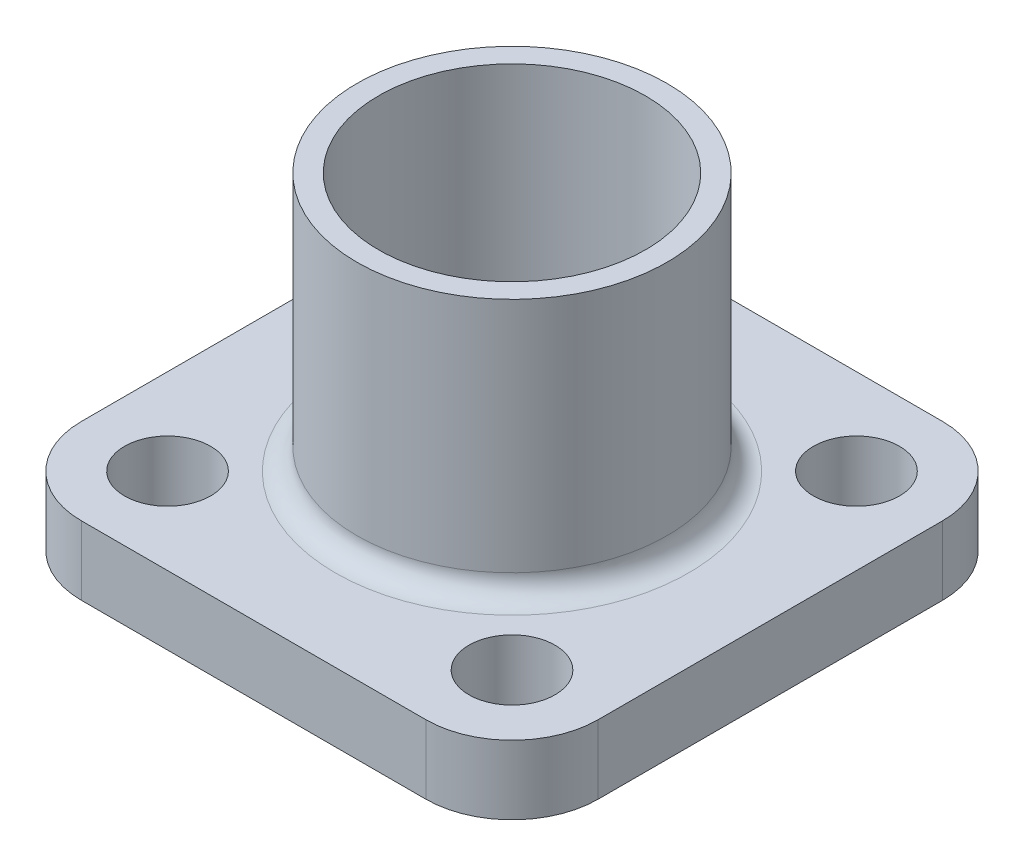
ISO-10303-21;
HEADER;
FILE_DESCRIPTION(('STEP AP214'),'2;1');
FILE_NAME('part.step','',(''),(''),'','','');
FILE_SCHEMA(('AUTOMOTIVE_DESIGN { 1 0 10303 214 1 1 1 1 }'));
ENDSEC;
DATA;
#1=APPLICATION_CONTEXT('core data for automotive mechanical design processes');
#2=APPLICATION_PROTOCOL_DEFINITION('international standard','automotive_design',2000,#1);
#3=PRODUCT_CONTEXT('',#1,'mechanical');
#4=PRODUCT('Part','Part','',(#3));
#5=PRODUCT_RELATED_PRODUCT_CATEGORY('part','',(#4));
#6=PRODUCT_DEFINITION_FORMATION('','',#4);
#7=PRODUCT_DEFINITION_CONTEXT('part definition',#1,'design');
#8=PRODUCT_DEFINITION('design','',#6,#7);
#9=PRODUCT_DEFINITION_SHAPE('','',#8);
#10=(LENGTH_UNIT() NAMED_UNIT(*) SI_UNIT(.MILLI.,.METRE.));
#11=(NAMED_UNIT(*) PLANE_ANGLE_UNIT() SI_UNIT($,.RADIAN.));
#12=(NAMED_UNIT(*) SI_UNIT($,.STERADIAN.) SOLID_ANGLE_UNIT());
#13=UNCERTAINTY_MEASURE_WITH_UNIT(LENGTH_MEASURE(1.E-05),#10,'distance_accuracy_value','');
#14=(GEOMETRIC_REPRESENTATION_CONTEXT(3) GLOBAL_UNCERTAINTY_ASSIGNED_CONTEXT((#13)) GLOBAL_UNIT_ASSIGNED_CONTEXT((#10,
#11,#12)) REPRESENTATION_CONTEXT('',''));
#15=CARTESIAN_POINT('',(0.,0.,0.));
#16=DIRECTION('',(0.,0.,1.));
#17=DIRECTION('',(1.,0.,0.));
#18=AXIS2_PLACEMENT_3D('',#15,#16,#17);
#19=CARTESIAN_POINT('',(0.,2.54,0.));
#20=DIRECTION('',(0.,-1.,0.));
#21=DIRECTION('',(0.,0.,-1.));
#22=AXIS2_PLACEMENT_3D('',#19,#20,#21);
#23=PLANE('',#22);
#24=CARTESIAN_POINT('',(0.,2.54,0.));
#25=DIRECTION('',(0.,-1.,0.));
#26=DIRECTION('',(0.,0.,-1.));
#27=AXIS2_PLACEMENT_3D('',#24,#25,#26);
#28=CIRCLE('',#27,4.1275);
#29=CARTESIAN_POINT('',(0.,2.54,-4.1275));
#30=VERTEX_POINT('',#29);
#31=EDGE_CURVE('E143',#30,#30,#28,.F.);
#32=ORIENTED_EDGE('',*,*,#31,.T.);
#33=EDGE_LOOP('',(#32));
#34=FACE_BOUND('',#33,.T.);
#35=CARTESIAN_POINT('',(0.,2.54,0.));
#36=DIRECTION('',(0.,1.,0.));
#37=DIRECTION('',(0.,0.,1.));
#38=AXIS2_PLACEMENT_3D('',#35,#36,#37);
#39=CIRCLE('',#38,3.96875);
#40=CARTESIAN_POINT('',(0.,2.54,3.96875));
#41=VERTEX_POINT('',#40);
#42=EDGE_CURVE('E214',#41,#41,#39,.T.);
#43=ORIENTED_EDGE('',*,*,#42,.F.);
#44=EDGE_LOOP('',(#43));
#45=FACE_BOUND('',#44,.T.);
#46=ADVANCED_FACE('F32',(#34,#45),#23,.F.);
#47=CARTESIAN_POINT('',(0.,2.54,0.));
#48=DIRECTION('',(0.,-1.,0.));
#49=DIRECTION('',(0.,0.,-1.));
#50=AXIS2_PLACEMENT_3D('',#47,#48,#49);
#51=CIRCLE('',#50,6.50875);
#52=CARTESIAN_POINT('',(0.,2.54,-6.50875));
#53=VERTEX_POINT('',#52);
#54=EDGE_CURVE('E139',#53,#53,#51,.T.);
#55=ORIENTED_EDGE('',*,*,#54,.T.);
#56=EDGE_LOOP('',(#55));
#57=FACE_BOUND('',#56,.T.);
#58=DIRECTION('',(0.,0.,-1.));
#59=VECTOR('',#58,1.);
#60=CARTESIAN_POINT('',(9.525,2.54,9.525));
#61=LINE('',#60,#59);
#62=CARTESIAN_POINT('',(9.525,2.54,6.35));
#63=VERTEX_POINT('',#62);
#64=CARTESIAN_POINT('',(9.525,2.54,-6.35));
#65=VERTEX_POINT('',#64);
#66=EDGE_CURVE('E135',#63,#65,#61,.T.);
#67=ORIENTED_EDGE('',*,*,#66,.T.);
#68=CARTESIAN_POINT('',(6.35,2.54,-6.35));
#69=DIRECTION('',(0.,-1.,0.));
#70=DIRECTION('',(0.,0.,-1.));
#71=AXIS2_PLACEMENT_3D('',#68,#69,#70);
#72=CIRCLE('',#71,3.175);
#73=CARTESIAN_POINT('',(6.34999999999999,2.54,-9.525));
#74=VERTEX_POINT('',#73);
#75=EDGE_CURVE('E162',#65,#74,#72,.F.);
#76=ORIENTED_EDGE('',*,*,#75,.T.);
#77=DIRECTION('',(-1.,0.,0.));
#78=VECTOR('',#77,1.);
#79=CARTESIAN_POINT('',(-9.525,2.54,-9.525));
#80=LINE('',#79,#78);
#81=CARTESIAN_POINT('',(-6.35,2.54,-9.525));
#82=VERTEX_POINT('',#81);
#83=EDGE_CURVE('E117',#74,#82,#80,.T.);
#84=ORIENTED_EDGE('',*,*,#83,.T.);
#85=CARTESIAN_POINT('',(-6.35,2.54,-6.35));
#86=DIRECTION('',(0.,-1.,0.));
#87=DIRECTION('',(0.,0.,-1.));
#88=AXIS2_PLACEMENT_3D('',#85,#86,#87);
#89=CIRCLE('',#88,3.175);
#90=CARTESIAN_POINT('',(-9.525,2.54,-6.34999999999999));
#91=VERTEX_POINT('',#90);
#92=EDGE_CURVE('E160',#82,#91,#89,.F.);
#93=ORIENTED_EDGE('',*,*,#92,.T.);
#94=DIRECTION('',(0.,0.,1.));
#95=VECTOR('',#94,1.);
#96=CARTESIAN_POINT('',(-9.525,2.54,9.525));
#97=LINE('',#96,#95);
#98=CARTESIAN_POINT('',(-9.525,2.54,6.35));
#99=VERTEX_POINT('',#98);
#100=EDGE_CURVE('E182',#91,#99,#97,.T.);
#101=ORIENTED_EDGE('',*,*,#100,.T.);
#102=CARTESIAN_POINT('',(-6.35,2.54,6.35));
#103=DIRECTION('',(0.,-1.,0.));
#104=DIRECTION('',(0.,0.,-1.));
#105=AXIS2_PLACEMENT_3D('',#102,#103,#104);
#106=CIRCLE('',#105,3.175);
#107=CARTESIAN_POINT('',(-6.35,2.54,9.525));
#108=VERTEX_POINT('',#107);
#109=EDGE_CURVE('E52',#99,#108,#106,.F.);
#110=ORIENTED_EDGE('',*,*,#109,.T.);
#111=DIRECTION('',(1.,0.,0.));
#112=VECTOR('',#111,1.);
#113=CARTESIAN_POINT('',(-9.525,2.54,9.525));
#114=LINE('',#113,#112);
#115=CARTESIAN_POINT('',(6.34999999999999,2.54,9.525));
#116=VERTEX_POINT('',#115);
#117=EDGE_CURVE('E140',#108,#116,#114,.T.);
#118=ORIENTED_EDGE('',*,*,#117,.T.);
#119=CARTESIAN_POINT('',(6.35,2.54,6.35));
#120=DIRECTION('',(0.,-1.,0.));
#121=DIRECTION('',(0.,0.,-1.));
#122=AXIS2_PLACEMENT_3D('',#119,#120,#121);
#123=CIRCLE('',#122,3.175);
#124=EDGE_CURVE('E158',#116,#63,#123,.F.);
#125=ORIENTED_EDGE('',*,*,#124,.T.);
#126=EDGE_LOOP('',(#67,#76,#84,#93,#101,#110,#118,#125));
#127=FACE_BOUND('',#126,.T.);
#128=CARTESIAN_POINT('',(-6.35,2.54,-6.35));
#129=DIRECTION('',(0.,1.,0.));
#130=DIRECTION('',(0.,0.,1.));
#131=AXIS2_PLACEMENT_3D('',#128,#129,#130);
#132=CIRCLE('',#131,1.5875);
#133=CARTESIAN_POINT('',(-6.35,2.54,-4.7625));
#134=VERTEX_POINT('',#133);
#135=EDGE_CURVE('E130',#134,#134,#132,.T.);
#136=ORIENTED_EDGE('',*,*,#135,.F.);
#137=EDGE_LOOP('',(#136));
#138=FACE_BOUND('',#137,.T.);
#139=CARTESIAN_POINT('',(6.35,2.54,-6.35));
#140=DIRECTION('',(0.,1.,0.));
#141=DIRECTION('',(0.,0.,1.));
#142=AXIS2_PLACEMENT_3D('',#139,#140,#141);
#143=CIRCLE('',#142,1.5875);
#144=CARTESIAN_POINT('',(6.35,2.54,-4.7625));
#145=VERTEX_POINT('',#144);
#146=EDGE_CURVE('E199',#145,#145,#143,.T.);
#147=ORIENTED_EDGE('',*,*,#146,.F.);
#148=EDGE_LOOP('',(#147));
#149=FACE_BOUND('',#148,.T.);
#150=CARTESIAN_POINT('',(6.35,2.54,6.35));
#151=DIRECTION('',(0.,1.,0.));
#152=DIRECTION('',(0.,0.,1.));
#153=AXIS2_PLACEMENT_3D('',#150,#151,#152);
#154=CIRCLE('',#153,1.5875);
#155=CARTESIAN_POINT('',(6.35,2.54,7.9375));
#156=VERTEX_POINT('',#155);
#157=EDGE_CURVE('E203',#156,#156,#154,.T.);
#158=ORIENTED_EDGE('',*,*,#157,.F.);
#159=EDGE_LOOP('',(#158));
#160=FACE_BOUND('',#159,.T.);
#161=CARTESIAN_POINT('',(-6.35,2.54,6.35));
#162=DIRECTION('',(0.,1.,0.));
#163=DIRECTION('',(0.,0.,1.));
#164=AXIS2_PLACEMENT_3D('',#161,#162,#163);
#165=CIRCLE('',#164,1.5875);
#166=CARTESIAN_POINT('',(-6.35,2.54,7.9375));
#167=VERTEX_POINT('',#166);
#168=EDGE_CURVE('E206',#167,#167,#165,.T.);
#169=ORIENTED_EDGE('',*,*,#168,.F.);
#170=EDGE_LOOP('',(#169));
#171=FACE_BOUND('',#170,.T.);
#172=ADVANCED_FACE('F188',(#57,#127,#138,#149,#160,#171),#23,.F.);
#173=CARTESIAN_POINT('',(0.,0.,0.));
#174=DIRECTION('',(0.,-1.,0.));
#175=DIRECTION('',(0.,0.,-1.));
#176=AXIS2_PLACEMENT_3D('',#173,#174,#175);
#177=PLANE('',#176);
#178=CARTESIAN_POINT('',(-6.35,0.,6.35));
#179=DIRECTION('',(0.,1.,0.));
#180=DIRECTION('',(0.,0.,1.));
#181=AXIS2_PLACEMENT_3D('',#178,#179,#180);
#182=CIRCLE('',#181,1.5875);
#183=CARTESIAN_POINT('',(-6.35,0.,7.9375));
#184=VERTEX_POINT('',#183);
#185=EDGE_CURVE('E209',#184,#184,#182,.T.);
#186=ORIENTED_EDGE('',*,*,#185,.T.);
#187=EDGE_LOOP('',(#186));
#188=FACE_BOUND('',#187,.T.);
#189=CARTESIAN_POINT('',(6.35,0.,-6.35));
#190=DIRECTION('',(0.,1.,0.));
#191=DIRECTION('',(0.,0.,1.));
#192=AXIS2_PLACEMENT_3D('',#189,#190,#191);
#193=CIRCLE('',#192,1.5875);
#194=CARTESIAN_POINT('',(6.35,0.,-4.7625));
#195=VERTEX_POINT('',#194);
#196=EDGE_CURVE('E220',#195,#195,#193,.T.);
#197=ORIENTED_EDGE('',*,*,#196,.T.);
#198=EDGE_LOOP('',(#197));
#199=FACE_BOUND('',#198,.T.);
#200=DIRECTION('',(-1.,0.,0.));
#201=VECTOR('',#200,1.);
#202=CARTESIAN_POINT('',(-9.525,0.,-9.525));
#203=LINE('',#202,#201);
#204=CARTESIAN_POINT('',(6.34999999999999,0.,-9.525));
#205=VERTEX_POINT('',#204);
#206=CARTESIAN_POINT('',(-6.35,0.,-9.525));
#207=VERTEX_POINT('',#206);
#208=EDGE_CURVE('E114',#205,#207,#203,.T.);
#209=ORIENTED_EDGE('',*,*,#208,.F.);
#210=CARTESIAN_POINT('',(6.35,0.,-6.35));
#211=DIRECTION('',(0.,-1.,0.));
#212=DIRECTION('',(0.,0.,-1.));
#213=AXIS2_PLACEMENT_3D('',#210,#211,#212);
#214=CIRCLE('',#213,3.175);
#215=CARTESIAN_POINT('',(9.525,0.,-6.35));
#216=VERTEX_POINT('',#215);
#217=EDGE_CURVE('E97',#205,#216,#214,.T.);
#218=ORIENTED_EDGE('',*,*,#217,.T.);
#219=DIRECTION('',(0.,0.,-1.));
#220=VECTOR('',#219,1.);
#221=CARTESIAN_POINT('',(9.525,0.,9.525));
#222=LINE('',#221,#220);
#223=CARTESIAN_POINT('',(9.525,0.,6.35));
#224=VERTEX_POINT('',#223);
#225=EDGE_CURVE('E125',#224,#216,#222,.T.);
#226=ORIENTED_EDGE('',*,*,#225,.F.);
#227=CARTESIAN_POINT('',(6.35,0.,6.35));
#228=DIRECTION('',(0.,-1.,0.));
#229=DIRECTION('',(0.,0.,-1.));
#230=AXIS2_PLACEMENT_3D('',#227,#228,#229);
#231=CIRCLE('',#230,3.175);
#232=CARTESIAN_POINT('',(6.34999999999999,0.,9.525));
#233=VERTEX_POINT('',#232);
#234=EDGE_CURVE('E151',#224,#233,#231,.T.);
#235=ORIENTED_EDGE('',*,*,#234,.T.);
#236=DIRECTION('',(1.,0.,0.));
#237=VECTOR('',#236,1.);
#238=CARTESIAN_POINT('',(-9.525,0.,9.525));
#239=LINE('',#238,#237);
#240=CARTESIAN_POINT('',(-6.35,0.,9.525));
#241=VERTEX_POINT('',#240);
#242=EDGE_CURVE('E128',#241,#233,#239,.T.);
#243=ORIENTED_EDGE('',*,*,#242,.F.);
#244=CARTESIAN_POINT('',(-6.35,0.,6.35));
#245=DIRECTION('',(0.,-1.,0.));
#246=DIRECTION('',(0.,0.,-1.));
#247=AXIS2_PLACEMENT_3D('',#244,#245,#246);
#248=CIRCLE('',#247,3.175);
#249=CARTESIAN_POINT('',(-9.525,0.,6.35));
#250=VERTEX_POINT('',#249);
#251=EDGE_CURVE('E118',#241,#250,#248,.T.);
#252=ORIENTED_EDGE('',*,*,#251,.T.);
#253=DIRECTION('',(0.,0.,1.));
#254=VECTOR('',#253,1.);
#255=CARTESIAN_POINT('',(-9.525,0.,9.525));
#256=LINE('',#255,#254);
#257=CARTESIAN_POINT('',(-9.525,0.,-6.34999999999999));
#258=VERTEX_POINT('',#257);
#259=EDGE_CURVE('E124',#258,#250,#256,.T.);
#260=ORIENTED_EDGE('',*,*,#259,.F.);
#261=CARTESIAN_POINT('',(-6.35,0.,-6.35));
#262=DIRECTION('',(0.,-1.,0.));
#263=DIRECTION('',(0.,0.,-1.));
#264=AXIS2_PLACEMENT_3D('',#261,#262,#263);
#265=CIRCLE('',#264,3.175);
#266=EDGE_CURVE('E108',#258,#207,#265,.T.);
#267=ORIENTED_EDGE('',*,*,#266,.T.);
#268=EDGE_LOOP('',(#209,#218,#226,#235,#243,#252,#260,#267));
#269=FACE_BOUND('',#268,.T.);
#270=CARTESIAN_POINT('',(-6.35,0.,-6.35));
#271=DIRECTION('',(0.,1.,0.));
#272=DIRECTION('',(0.,0.,1.));
#273=AXIS2_PLACEMENT_3D('',#270,#271,#272);
#274=CIRCLE('',#273,1.5875);
#275=CARTESIAN_POINT('',(-6.35,0.,-4.7625));
#276=VERTEX_POINT('',#275);
#277=EDGE_CURVE('E185',#276,#276,#274,.T.);
#278=ORIENTED_EDGE('',*,*,#277,.T.);
#279=EDGE_LOOP('',(#278));
#280=FACE_BOUND('',#279,.T.);
#281=CARTESIAN_POINT('',(6.35,0.,6.35));
#282=DIRECTION('',(0.,1.,0.));
#283=DIRECTION('',(0.,0.,1.));
#284=AXIS2_PLACEMENT_3D('',#281,#282,#283);
#285=CIRCLE('',#284,1.5875);
#286=CARTESIAN_POINT('',(6.35,0.,7.9375));
#287=VERTEX_POINT('',#286);
#288=EDGE_CURVE('E208',#287,#287,#285,.T.);
#289=ORIENTED_EDGE('',*,*,#288,.T.);
#290=EDGE_LOOP('',(#289));
#291=FACE_BOUND('',#290,.T.);
#292=CARTESIAN_POINT('',(0.,0.,0.));
#293=DIRECTION('',(0.,1.,0.));
#294=DIRECTION('',(0.,0.,1.));
#295=AXIS2_PLACEMENT_3D('',#292,#293,#294);
#296=CIRCLE('',#295,3.96875);
#297=CARTESIAN_POINT('',(0.,0.,3.96875));
#298=VERTEX_POINT('',#297);
#299=EDGE_CURVE('E217',#298,#298,#296,.T.);
#300=ORIENTED_EDGE('',*,*,#299,.T.);
#301=EDGE_LOOP('',(#300));
#302=FACE_BOUND('',#301,.T.);
#303=ADVANCED_FACE('F121',(#188,#199,#269,#280,#291,#302),#177,.T.);
#304=CARTESIAN_POINT('',(9.525,2.54,9.525));
#305=DIRECTION('',(-1.,0.,0.));
#306=DIRECTION('',(0.,0.,1.));
#307=AXIS2_PLACEMENT_3D('',#304,#305,#306);
#308=PLANE('',#307);
#309=ORIENTED_EDGE('',*,*,#225,.T.);
#310=DIRECTION('',(0.,-1.,0.));
#311=VECTOR('',#310,1.);
#312=CARTESIAN_POINT('',(9.525,2.54,-6.35));
#313=LINE('',#312,#311);
#314=EDGE_CURVE('E102',#216,#65,#313,.F.);
#315=ORIENTED_EDGE('',*,*,#314,.T.);
#316=ORIENTED_EDGE('',*,*,#66,.F.);
#317=DIRECTION('',(0.,-1.,0.));
#318=VECTOR('',#317,1.);
#319=CARTESIAN_POINT('',(9.525,2.54,6.35));
#320=LINE('',#319,#318);
#321=EDGE_CURVE('E107',#63,#224,#320,.T.);
#322=ORIENTED_EDGE('',*,*,#321,.T.);
#323=EDGE_LOOP('',(#309,#315,#316,#322));
#324=FACE_BOUND('',#323,.T.);
#325=ADVANCED_FACE('F179',(#324),#308,.F.);
#326=CARTESIAN_POINT('',(-9.525,2.54,-9.525));
#327=DIRECTION('',(0.,0.,1.));
#328=DIRECTION('',(1.,0.,0.));
#329=AXIS2_PLACEMENT_3D('',#326,#327,#328);
#330=PLANE('',#329);
#331=ORIENTED_EDGE('',*,*,#83,.F.);
#332=DIRECTION('',(0.,-1.,0.));
#333=VECTOR('',#332,1.);
#334=CARTESIAN_POINT('',(6.35,2.54,-9.525));
#335=LINE('',#334,#333);
#336=EDGE_CURVE('E101',#74,#205,#335,.T.);
#337=ORIENTED_EDGE('',*,*,#336,.T.);
#338=ORIENTED_EDGE('',*,*,#208,.T.);
#339=DIRECTION('',(0.,-1.,0.));
#340=VECTOR('',#339,1.);
#341=CARTESIAN_POINT('',(-6.35,2.54,-9.525));
#342=LINE('',#341,#340);
#343=EDGE_CURVE('E119',#207,#82,#342,.F.);
#344=ORIENTED_EDGE('',*,*,#343,.T.);
#345=EDGE_LOOP('',(#331,#337,#338,#344));
#346=FACE_BOUND('',#345,.T.);
#347=ADVANCED_FACE('F113',(#346),#330,.F.);
#348=CARTESIAN_POINT('',(-9.525,2.54,9.525));
#349=DIRECTION('',(1.,0.,0.));
#350=DIRECTION('',(0.,0.,-1.));
#351=AXIS2_PLACEMENT_3D('',#348,#349,#350);
#352=PLANE('',#351);
#353=ORIENTED_EDGE('',*,*,#100,.F.);
#354=DIRECTION('',(0.,-1.,0.));
#355=VECTOR('',#354,1.);
#356=CARTESIAN_POINT('',(-9.525,2.54,-6.35));
#357=LINE('',#356,#355);
#358=EDGE_CURVE('E166',#91,#258,#357,.T.);
#359=ORIENTED_EDGE('',*,*,#358,.T.);
#360=ORIENTED_EDGE('',*,*,#259,.T.);
#361=DIRECTION('',(0.,-1.,0.));
#362=VECTOR('',#361,1.);
#363=CARTESIAN_POINT('',(-9.525,2.54,6.35));
#364=LINE('',#363,#362);
#365=EDGE_CURVE('E164',#250,#99,#364,.F.);
#366=ORIENTED_EDGE('',*,*,#365,.T.);
#367=EDGE_LOOP('',(#353,#359,#360,#366));
#368=FACE_BOUND('',#367,.T.);
#369=ADVANCED_FACE('F240',(#368),#352,.F.);
#370=CARTESIAN_POINT('',(-9.525,2.54,9.525));
#371=DIRECTION('',(0.,0.,-1.));
#372=DIRECTION('',(-1.,0.,0.));
#373=AXIS2_PLACEMENT_3D('',#370,#371,#372);
#374=PLANE('',#373);
#375=ORIENTED_EDGE('',*,*,#242,.T.);
#376=DIRECTION('',(0.,-1.,0.));
#377=VECTOR('',#376,1.);
#378=CARTESIAN_POINT('',(6.35,2.54,9.525));
#379=LINE('',#378,#377);
#380=EDGE_CURVE('E11',#233,#116,#379,.F.);
#381=ORIENTED_EDGE('',*,*,#380,.T.);
#382=ORIENTED_EDGE('',*,*,#117,.F.);
#383=DIRECTION('',(0.,-1.,0.));
#384=VECTOR('',#383,1.);
#385=CARTESIAN_POINT('',(-6.35,2.54,9.525));
#386=LINE('',#385,#384);
#387=EDGE_CURVE('E40',#108,#241,#386,.T.);
#388=ORIENTED_EDGE('',*,*,#387,.T.);
#389=EDGE_LOOP('',(#375,#381,#382,#388));
#390=FACE_BOUND('',#389,.T.);
#391=ADVANCED_FACE('F171',(#390),#374,.F.);
#392=CARTESIAN_POINT('',(-6.35,2.54,-6.35));
#393=DIRECTION('',(0.,-1.,0.));
#394=DIRECTION('',(0.,0.,-1.));
#395=AXIS2_PLACEMENT_3D('',#392,#393,#394);
#396=CYLINDRICAL_SURFACE('',#395,1.5875);
#397=ORIENTED_EDGE('',*,*,#135,.T.);
#398=EDGE_LOOP('',(#397));
#399=FACE_BOUND('',#398,.T.);
#400=ORIENTED_EDGE('',*,*,#277,.F.);
#401=EDGE_LOOP('',(#400));
#402=FACE_BOUND('',#401,.T.);
#403=ADVANCED_FACE('F229',(#399,#402),#396,.F.);
#404=CARTESIAN_POINT('',(6.35,2.54,-6.35));
#405=DIRECTION('',(0.,-1.,0.));
#406=DIRECTION('',(0.,0.,-1.));
#407=AXIS2_PLACEMENT_3D('',#404,#405,#406);
#408=CYLINDRICAL_SURFACE('',#407,1.5875);
#409=ORIENTED_EDGE('',*,*,#146,.T.);
#410=EDGE_LOOP('',(#409));
#411=FACE_BOUND('',#410,.T.);
#412=ORIENTED_EDGE('',*,*,#196,.F.);
#413=EDGE_LOOP('',(#412));
#414=FACE_BOUND('',#413,.T.);
#415=ADVANCED_FACE('F231',(#411,#414),#408,.F.);
#416=CARTESIAN_POINT('',(6.35,2.54,6.35));
#417=DIRECTION('',(0.,-1.,0.));
#418=DIRECTION('',(0.,0.,-1.));
#419=AXIS2_PLACEMENT_3D('',#416,#417,#418);
#420=CYLINDRICAL_SURFACE('',#419,1.5875);
#421=ORIENTED_EDGE('',*,*,#157,.T.);
#422=EDGE_LOOP('',(#421));
#423=FACE_BOUND('',#422,.T.);
#424=ORIENTED_EDGE('',*,*,#288,.F.);
#425=EDGE_LOOP('',(#424));
#426=FACE_BOUND('',#425,.T.);
#427=ADVANCED_FACE('F237',(#423,#426),#420,.F.);
#428=CARTESIAN_POINT('',(-6.35,2.54,6.35));
#429=DIRECTION('',(0.,-1.,0.));
#430=DIRECTION('',(0.,0.,-1.));
#431=AXIS2_PLACEMENT_3D('',#428,#429,#430);
#432=CYLINDRICAL_SURFACE('',#431,1.5875);
#433=ORIENTED_EDGE('',*,*,#168,.T.);
#434=EDGE_LOOP('',(#433));
#435=FACE_BOUND('',#434,.T.);
#436=ORIENTED_EDGE('',*,*,#185,.F.);
#437=EDGE_LOOP('',(#436));
#438=FACE_BOUND('',#437,.T.);
#439=ADVANCED_FACE('F390',(#435,#438),#432,.F.);
#440=CARTESIAN_POINT('',(0.,2.54,0.));
#441=DIRECTION('',(0.,-1.,0.));
#442=DIRECTION('',(0.,0.,-1.));
#443=AXIS2_PLACEMENT_3D('',#440,#441,#442);
#444=CYLINDRICAL_SURFACE('',#443,3.96875);
#445=ORIENTED_EDGE('',*,*,#42,.T.);
#446=EDGE_LOOP('',(#445));
#447=FACE_BOUND('',#446,.T.);
#448=ORIENTED_EDGE('',*,*,#299,.F.);
#449=EDGE_LOOP('',(#448));
#450=FACE_BOUND('',#449,.T.);
#451=ADVANCED_FACE('F381',(#447,#450),#444,.F.);
#452=CARTESIAN_POINT('',(0.,12.065,0.));
#453=DIRECTION('',(0.,1.,0.));
#454=DIRECTION('',(0.,0.,1.));
#455=AXIS2_PLACEMENT_3D('',#452,#453,#454);
#456=PLANE('',#455);
#457=CARTESIAN_POINT('',(0.,12.065,0.));
#458=DIRECTION('',(0.,1.,0.));
#459=DIRECTION('',(0.,0.,1.));
#460=AXIS2_PLACEMENT_3D('',#457,#458,#459);
#461=CIRCLE('',#460,5.715);
#462=CARTESIAN_POINT('',(0.,12.065,-5.715));
#463=VERTEX_POINT('',#462);
#464=EDGE_CURVE('E427',#463,#463,#461,.T.);
#465=ORIENTED_EDGE('',*,*,#464,.T.);
#466=EDGE_LOOP('',(#465));
#467=FACE_BOUND('',#466,.T.);
#468=CARTESIAN_POINT('',(0.,12.065,0.));
#469=DIRECTION('',(0.,1.,0.));
#470=DIRECTION('',(0.,0.,1.));
#471=AXIS2_PLACEMENT_3D('',#468,#469,#470);
#472=CIRCLE('',#471,4.92125);
#473=CARTESIAN_POINT('',(0.,12.065,-4.92125));
#474=VERTEX_POINT('',#473);
#475=EDGE_CURVE('E430',#474,#474,#472,.T.);
#476=ORIENTED_EDGE('',*,*,#475,.F.);
#477=EDGE_LOOP('',(#476));
#478=FACE_BOUND('',#477,.T.);
#479=ADVANCED_FACE('F365',(#467,#478),#456,.T.);
#480=CARTESIAN_POINT('',(0.,12.065,0.));
#481=DIRECTION('',(0.,-1.,0.));
#482=DIRECTION('',(0.,0.,-1.));
#483=AXIS2_PLACEMENT_3D('',#480,#481,#482);
#484=CYLINDRICAL_SURFACE('',#483,5.715);
#485=CARTESIAN_POINT('',(0.,3.33375,0.));
#486=DIRECTION('',(0.,-1.,0.));
#487=DIRECTION('',(0.,0.,-1.));
#488=AXIS2_PLACEMENT_3D('',#485,#486,#487);
#489=CIRCLE('',#488,5.715);
#490=CARTESIAN_POINT('',(0.,3.33375,-5.715));
#491=VERTEX_POINT('',#490);
#492=EDGE_CURVE('E136',#491,#491,#489,.F.);
#493=CARTESIAN_POINT('',(0.,3.33375,-5.715));
#494=CARTESIAN_POINT('',(0.,3.42470052083333,-5.715));
#495=CARTESIAN_POINT('',(0.,3.51565104166667,-5.715));
#496=CARTESIAN_POINT('',(0.,3.69755208333333,-5.715));
#497=CARTESIAN_POINT('',(0.,3.78850260416667,-5.715));
#498=CARTESIAN_POINT('',(0.,3.97040364583333,-5.715));
#499=CARTESIAN_POINT('',(0.,4.06135416666667,-5.715));
#500=CARTESIAN_POINT('',(0.,4.24325520833333,-5.715));
#501=CARTESIAN_POINT('',(0.,4.33420572916667,-5.715));
#502=CARTESIAN_POINT('',(0.,4.51610677083333,-5.715));
#503=CARTESIAN_POINT('',(0.,4.60705729166667,-5.715));
#504=CARTESIAN_POINT('',(0.,4.78895833333333,-5.715));
#505=CARTESIAN_POINT('',(0.,4.87990885416667,-5.715));
#506=CARTESIAN_POINT('',(0.,5.06180989583333,-5.715));
#507=CARTESIAN_POINT('',(0.,5.15276041666667,-5.715));
#508=CARTESIAN_POINT('',(0.,5.33466145833333,-5.715));
#509=CARTESIAN_POINT('',(0.,5.42561197916667,-5.715));
#510=CARTESIAN_POINT('',(0.,5.60751302083333,-5.715));
#511=CARTESIAN_POINT('',(0.,5.69846354166667,-5.715));
#512=CARTESIAN_POINT('',(0.,5.88036458333333,-5.715));
#513=CARTESIAN_POINT('',(0.,5.97131510416667,-5.715));
#514=CARTESIAN_POINT('',(0.,6.15321614583333,-5.715));
#515=CARTESIAN_POINT('',(0.,6.24416666666667,-5.715));
#516=CARTESIAN_POINT('',(0.,6.42606770833333,-5.715));
#517=CARTESIAN_POINT('',(0.,6.51701822916667,-5.715));
#518=CARTESIAN_POINT('',(0.,6.69891927083333,-5.715));
#519=CARTESIAN_POINT('',(0.,6.78986979166667,-5.715));
#520=CARTESIAN_POINT('',(0.,6.97177083333333,-5.715));
#521=CARTESIAN_POINT('',(0.,7.06272135416667,-5.715));
#522=CARTESIAN_POINT('',(0.,7.24462239583333,-5.715));
#523=CARTESIAN_POINT('',(0.,7.33557291666667,-5.715));
#524=CARTESIAN_POINT('',(0.,7.51747395833333,-5.715));
#525=CARTESIAN_POINT('',(0.,7.60842447916667,-5.715));
#526=CARTESIAN_POINT('',(0.,7.79032552083333,-5.715));
#527=CARTESIAN_POINT('',(0.,7.88127604166667,-5.715));
#528=CARTESIAN_POINT('',(0.,8.06317708333333,-5.715));
#529=CARTESIAN_POINT('',(0.,8.15412760416667,-5.715));
#530=CARTESIAN_POINT('',(0.,8.33602864583333,-5.715));
#531=CARTESIAN_POINT('',(0.,8.42697916666667,-5.715));
#532=CARTESIAN_POINT('',(0.,8.60888020833333,-5.715));
#533=CARTESIAN_POINT('',(0.,8.69983072916667,-5.715));
#534=CARTESIAN_POINT('',(0.,8.88173177083333,-5.715));
#535=CARTESIAN_POINT('',(0.,8.97268229166667,-5.715));
#536=CARTESIAN_POINT('',(0.,9.15458333333333,-5.715));
#537=CARTESIAN_POINT('',(0.,9.24553385416667,-5.715));
#538=CARTESIAN_POINT('',(0.,9.42743489583333,-5.715));
#539=CARTESIAN_POINT('',(0.,9.51838541666667,-5.715));
#540=CARTESIAN_POINT('',(0.,9.70028645833333,-5.715));
#541=CARTESIAN_POINT('',(0.,9.79123697916667,-5.715));
#542=CARTESIAN_POINT('',(0.,9.97313802083333,-5.715));
#543=CARTESIAN_POINT('',(0.,10.0640885416667,-5.715));
#544=CARTESIAN_POINT('',(0.,10.2459895833333,-5.715));
#545=CARTESIAN_POINT('',(0.,10.3369401041667,-5.715));
#546=CARTESIAN_POINT('',(0.,10.5188411458333,-5.715));
#547=CARTESIAN_POINT('',(0.,10.6097916666667,-5.715));
#548=CARTESIAN_POINT('',(0.,10.7916927083333,-5.715));
#549=CARTESIAN_POINT('',(0.,10.8826432291667,-5.715));
#550=CARTESIAN_POINT('',(0.,11.0645442708333,-5.715));
#551=CARTESIAN_POINT('',(0.,11.1554947916667,-5.715));
#552=CARTESIAN_POINT('',(0.,11.3373958333333,-5.715));
#553=CARTESIAN_POINT('',(0.,11.4283463541667,-5.715));
#554=CARTESIAN_POINT('',(0.,11.6102473958333,-5.715));
#555=CARTESIAN_POINT('',(0.,11.7011979166667,-5.715));
#556=CARTESIAN_POINT('',(0.,11.8830989583333,-5.715));
#557=CARTESIAN_POINT('',(0.,11.9740494791667,-5.715));
#558=CARTESIAN_POINT('',(0.,12.065,-5.715));
#559=B_SPLINE_CURVE_WITH_KNOTS('',3,(#493,#494,#495,#496,#497,#498,#499,#500,#501,#502,#503,
#504,#505,#506,#507,#508,#509,#510,#511,#512,#513,#514,#515,#516,#517,#518,#519,#520,#521,#522,
#523,#524,#525,#526,#527,#528,#529,#530,#531,#532,#533,#534,#535,#536,#537,#538,#539,#540,#541,
#542,#543,#544,#545,#546,#547,#548,#549,#550,#551,#552,#553,#554,#555,#556,#557,#558),
.UNSPECIFIED.,.F.,.F.,(4,2,2,2,2,2,2,2,2,2,2,2,2,2,2,2,2,2,2,2,2,2,2,2,2,2,2,2,2,2,2,2,4),(0.,
0.272851562500001,0.545703125,0.8185546875,1.09140625,1.3642578125,1.637109375,1.9099609375,
2.1828125,2.4556640625,2.728515625,3.0013671875,3.27421875,3.5470703125,3.819921875,
4.0927734375,4.365625,4.6384765625,4.911328125,5.1841796875,5.45703125,5.7298828125,6.002734375,
6.2755859375,6.5484375,6.8212890625,7.094140625,7.3669921875,7.63984375,7.9126953125,
8.185546875,8.4583984375,8.73125),.UNSPECIFIED.);
#560=EDGE_CURVE('BSEAM356',#491,#463,#559,.T.);
#561=ORIENTED_EDGE('',*,*,#492,.T.);
#562=ORIENTED_EDGE('',*,*,#464,.F.);
#563=ORIENTED_EDGE('',*,*,#560,.T.);
#564=ORIENTED_EDGE('',*,*,#560,.F.);
#565=EDGE_LOOP('',(#561,#563,#562,#564));
#566=FACE_BOUND('',#565,.T.);
#567=ADVANCED_FACE('F356',(#566),#484,.T.);
#568=CARTESIAN_POINT('',(0.,12.065,0.));
#569=DIRECTION('',(0.,-1.,0.));
#570=DIRECTION('',(0.,0.,-1.));
#571=AXIS2_PLACEMENT_3D('',#568,#569,#570);
#572=CYLINDRICAL_SURFACE('',#571,4.92125);
#573=CARTESIAN_POINT('',(0.,3.33375,0.));
#574=DIRECTION('',(0.,-1.,0.));
#575=DIRECTION('',(0.,0.,-1.));
#576=AXIS2_PLACEMENT_3D('',#573,#574,#575);
#577=CIRCLE('',#576,4.92125);
#578=CARTESIAN_POINT('',(0.,3.33375,-4.92125));
#579=VERTEX_POINT('',#578);
#580=EDGE_CURVE('E146',#579,#579,#577,.T.);
#581=CARTESIAN_POINT('',(0.,3.33375,-4.92125));
#582=CARTESIAN_POINT('',(0.,3.42470052083333,-4.92125));
#583=CARTESIAN_POINT('',(0.,3.51565104166667,-4.92125));
#584=CARTESIAN_POINT('',(0.,3.69755208333333,-4.92125));
#585=CARTESIAN_POINT('',(0.,3.78850260416667,-4.92125));
#586=CARTESIAN_POINT('',(0.,3.97040364583333,-4.92125));
#587=CARTESIAN_POINT('',(0.,4.06135416666667,-4.92125));
#588=CARTESIAN_POINT('',(0.,4.24325520833333,-4.92125));
#589=CARTESIAN_POINT('',(0.,4.33420572916667,-4.92125));
#590=CARTESIAN_POINT('',(0.,4.51610677083333,-4.92125));
#591=CARTESIAN_POINT('',(0.,4.60705729166667,-4.92125));
#592=CARTESIAN_POINT('',(0.,4.78895833333333,-4.92125));
#593=CARTESIAN_POINT('',(0.,4.87990885416667,-4.92125));
#594=CARTESIAN_POINT('',(0.,5.06180989583333,-4.92125));
#595=CARTESIAN_POINT('',(0.,5.15276041666667,-4.92125));
#596=CARTESIAN_POINT('',(0.,5.33466145833333,-4.92125));
#597=CARTESIAN_POINT('',(0.,5.42561197916667,-4.92125));
#598=CARTESIAN_POINT('',(0.,5.60751302083333,-4.92125));
#599=CARTESIAN_POINT('',(0.,5.69846354166667,-4.92125));
#600=CARTESIAN_POINT('',(0.,5.88036458333333,-4.92125));
#601=CARTESIAN_POINT('',(0.,5.97131510416667,-4.92125));
#602=CARTESIAN_POINT('',(0.,6.15321614583333,-4.92125));
#603=CARTESIAN_POINT('',(0.,6.24416666666667,-4.92125));
#604=CARTESIAN_POINT('',(0.,6.42606770833333,-4.92125));
#605=CARTESIAN_POINT('',(0.,6.51701822916667,-4.92125));
#606=CARTESIAN_POINT('',(0.,6.69891927083333,-4.92125));
#607=CARTESIAN_POINT('',(0.,6.78986979166667,-4.92125));
#608=CARTESIAN_POINT('',(0.,6.97177083333333,-4.92125));
#609=CARTESIAN_POINT('',(0.,7.06272135416667,-4.92125));
#610=CARTESIAN_POINT('',(0.,7.24462239583333,-4.92125));
#611=CARTESIAN_POINT('',(0.,7.33557291666667,-4.92125));
#612=CARTESIAN_POINT('',(0.,7.51747395833333,-4.92125));
#613=CARTESIAN_POINT('',(0.,7.60842447916667,-4.92125));
#614=CARTESIAN_POINT('',(0.,7.79032552083333,-4.92125));
#615=CARTESIAN_POINT('',(0.,7.88127604166667,-4.92125));
#616=CARTESIAN_POINT('',(0.,8.06317708333333,-4.92125));
#617=CARTESIAN_POINT('',(0.,8.15412760416667,-4.92125));
#618=CARTESIAN_POINT('',(0.,8.33602864583333,-4.92125));
#619=CARTESIAN_POINT('',(0.,8.42697916666667,-4.92125));
#620=CARTESIAN_POINT('',(0.,8.60888020833333,-4.92125));
#621=CARTESIAN_POINT('',(0.,8.69983072916667,-4.92125));
#622=CARTESIAN_POINT('',(0.,8.88173177083333,-4.92125));
#623=CARTESIAN_POINT('',(0.,8.97268229166667,-4.92125));
#624=CARTESIAN_POINT('',(0.,9.15458333333333,-4.92125));
#625=CARTESIAN_POINT('',(0.,9.24553385416667,-4.92125));
#626=CARTESIAN_POINT('',(0.,9.42743489583333,-4.92125));
#627=CARTESIAN_POINT('',(0.,9.51838541666667,-4.92125));
#628=CARTESIAN_POINT('',(0.,9.70028645833333,-4.92125));
#629=CARTESIAN_POINT('',(0.,9.79123697916667,-4.92125));
#630=CARTESIAN_POINT('',(0.,9.97313802083333,-4.92125));
#631=CARTESIAN_POINT('',(0.,10.0640885416667,-4.92125));
#632=CARTESIAN_POINT('',(0.,10.2459895833333,-4.92125));
#633=CARTESIAN_POINT('',(0.,10.3369401041667,-4.92125));
#634=CARTESIAN_POINT('',(0.,10.5188411458333,-4.92125));
#635=CARTESIAN_POINT('',(0.,10.6097916666667,-4.92125));
#636=CARTESIAN_POINT('',(0.,10.7916927083333,-4.92125));
#637=CARTESIAN_POINT('',(0.,10.8826432291667,-4.92125));
#638=CARTESIAN_POINT('',(0.,11.0645442708333,-4.92125));
#639=CARTESIAN_POINT('',(0.,11.1554947916667,-4.92125));
#640=CARTESIAN_POINT('',(0.,11.3373958333333,-4.92125));
#641=CARTESIAN_POINT('',(0.,11.4283463541667,-4.92125));
#642=CARTESIAN_POINT('',(0.,11.6102473958333,-4.92125));
#643=CARTESIAN_POINT('',(0.,11.7011979166667,-4.92125));
#644=CARTESIAN_POINT('',(0.,11.8830989583333,-4.92125));
#645=CARTESIAN_POINT('',(0.,11.9740494791667,-4.92125));
#646=CARTESIAN_POINT('',(0.,12.065,-4.92125));
#647=B_SPLINE_CURVE_WITH_KNOTS('',3,(#581,#582,#583,#584,#585,#586,#587,#588,#589,#590,#591,
#592,#593,#594,#595,#596,#597,#598,#599,#600,#601,#602,#603,#604,#605,#606,#607,#608,#609,#610,
#611,#612,#613,#614,#615,#616,#617,#618,#619,#620,#621,#622,#623,#624,#625,#626,#627,#628,#629,
#630,#631,#632,#633,#634,#635,#636,#637,#638,#639,#640,#641,#642,#643,#644,#645,#646),
.UNSPECIFIED.,.F.,.F.,(4,2,2,2,2,2,2,2,2,2,2,2,2,2,2,2,2,2,2,2,2,2,2,2,2,2,2,2,2,2,2,2,4),(0.,
0.272851562500001,0.545703125,0.8185546875,1.09140625,1.3642578125,1.637109375,1.9099609375,
2.1828125,2.4556640625,2.728515625,3.0013671875,3.27421875,3.5470703125,3.819921875,
4.0927734375,4.365625,4.6384765625,4.911328125,5.1841796875,5.45703125,5.7298828125,6.002734375,
6.2755859375,6.5484375,6.8212890625,7.094140625,7.3669921875,7.63984375,7.9126953125,
8.185546875,8.4583984375,8.73125),.UNSPECIFIED.);
#648=EDGE_CURVE('BSEAM262',#579,#474,#647,.T.);
#649=ORIENTED_EDGE('',*,*,#580,.T.);
#650=ORIENTED_EDGE('',*,*,#475,.T.);
#651=ORIENTED_EDGE('',*,*,#648,.T.);
#652=ORIENTED_EDGE('',*,*,#648,.F.);
#653=EDGE_LOOP('',(#649,#651,#650,#652));
#654=FACE_BOUND('',#653,.T.);
#655=ADVANCED_FACE('F262',(#654),#572,.F.);
#656=CARTESIAN_POINT('',(0.,3.33375,0.));
#657=DIRECTION('',(0.,-1.,0.));
#658=DIRECTION('',(0.,0.,-1.));
#659=AXIS2_PLACEMENT_3D('',#656,#657,#658);
#660=TOROIDAL_SURFACE('',#659,6.50875,0.79375);
#661=ORIENTED_EDGE('',*,*,#54,.F.);
#662=EDGE_LOOP('',(#661));
#663=FACE_BOUND('',#662,.T.);
#664=ORIENTED_EDGE('',*,*,#492,.F.);
#665=EDGE_LOOP('',(#664));
#666=FACE_BOUND('',#665,.T.);
#667=ADVANCED_FACE('F258',(#663,#666),#660,.F.);
#668=CARTESIAN_POINT('',(0.,3.33375,0.));
#669=DIRECTION('',(0.,-1.,0.));
#670=DIRECTION('',(0.,0.,-1.));
#671=AXIS2_PLACEMENT_3D('',#668,#669,#670);
#672=TOROIDAL_SURFACE('',#671,4.1275,0.79375);
#673=ORIENTED_EDGE('',*,*,#580,.F.);
#674=EDGE_LOOP('',(#673));
#675=FACE_BOUND('',#674,.T.);
#676=ORIENTED_EDGE('',*,*,#31,.F.);
#677=EDGE_LOOP('',(#676));
#678=FACE_BOUND('',#677,.T.);
#679=ADVANCED_FACE('F261',(#675,#678),#672,.F.);
#680=CARTESIAN_POINT('',(6.35,2.54,-6.35));
#681=DIRECTION('',(0.,-1.,0.));
#682=DIRECTION('',(0.,0.,-1.));
#683=AXIS2_PLACEMENT_3D('',#680,#681,#682);
#684=CYLINDRICAL_SURFACE('',#683,3.175);
#685=ORIENTED_EDGE('',*,*,#75,.F.);
#686=ORIENTED_EDGE('',*,*,#314,.F.);
#687=ORIENTED_EDGE('',*,*,#217,.F.);
#688=ORIENTED_EDGE('',*,*,#336,.F.);
#689=EDGE_LOOP('',(#685,#686,#687,#688));
#690=FACE_BOUND('',#689,.T.);
#691=ADVANCED_FACE('F100',(#690),#684,.T.);
#692=CARTESIAN_POINT('',(-6.35,2.54,-6.35));
#693=DIRECTION('',(0.,-1.,0.));
#694=DIRECTION('',(0.,0.,-1.));
#695=AXIS2_PLACEMENT_3D('',#692,#693,#694);
#696=CYLINDRICAL_SURFACE('',#695,3.175);
#697=ORIENTED_EDGE('',*,*,#92,.F.);
#698=ORIENTED_EDGE('',*,*,#343,.F.);
#699=ORIENTED_EDGE('',*,*,#266,.F.);
#700=ORIENTED_EDGE('',*,*,#358,.F.);
#701=EDGE_LOOP('',(#697,#698,#699,#700));
#702=FACE_BOUND('',#701,.T.);
#703=ADVANCED_FACE('F269',(#702),#696,.T.);
#704=CARTESIAN_POINT('',(6.35,2.54,6.35));
#705=DIRECTION('',(0.,-1.,0.));
#706=DIRECTION('',(0.,0.,-1.));
#707=AXIS2_PLACEMENT_3D('',#704,#705,#706);
#708=CYLINDRICAL_SURFACE('',#707,3.175);
#709=ORIENTED_EDGE('',*,*,#124,.F.);
#710=ORIENTED_EDGE('',*,*,#380,.F.);
#711=ORIENTED_EDGE('',*,*,#234,.F.);
#712=ORIENTED_EDGE('',*,*,#321,.F.);
#713=EDGE_LOOP('',(#709,#710,#711,#712));
#714=FACE_BOUND('',#713,.T.);
#715=ADVANCED_FACE('F176',(#714),#708,.T.);
#716=CARTESIAN_POINT('',(-6.35,2.54,6.35));
#717=DIRECTION('',(0.,-1.,0.));
#718=DIRECTION('',(0.,0.,-1.));
#719=AXIS2_PLACEMENT_3D('',#716,#717,#718);
#720=CYLINDRICAL_SURFACE('',#719,3.175);
#721=ORIENTED_EDGE('',*,*,#109,.F.);
#722=ORIENTED_EDGE('',*,*,#365,.F.);
#723=ORIENTED_EDGE('',*,*,#251,.F.);
#724=ORIENTED_EDGE('',*,*,#387,.F.);
#725=EDGE_LOOP('',(#721,#722,#723,#724));
#726=FACE_BOUND('',#725,.T.);
#727=ADVANCED_FACE('F34',(#726),#720,.T.);
#728=CLOSED_SHELL('',(#46,#172,#303,#325,#347,#369,#391,#403,#415,#427,#439,#451,#479,#567,#655,
#667,#679,#691,#703,#715,#727));
#729=MANIFOLD_SOLID_BREP('B2',#728);
#730=ADVANCED_BREP_SHAPE_REPRESENTATION('',(#18,#729),#14);
#731=SHAPE_DEFINITION_REPRESENTATION(#9,#730);
ENDSEC;
END-ISO-10303-21;
